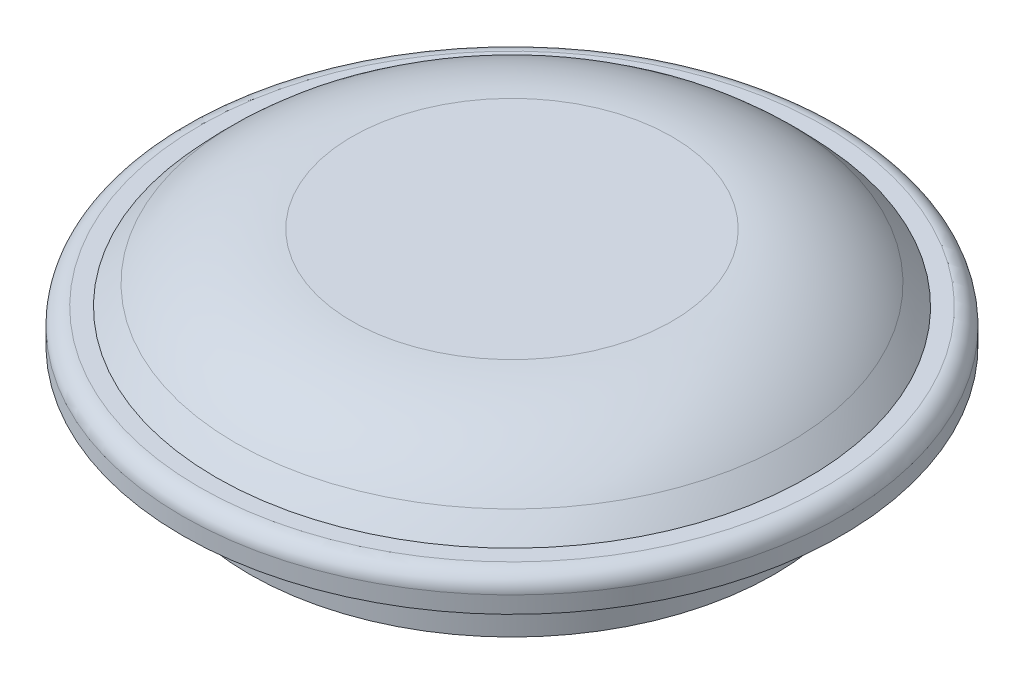
ISO-10303-21;
HEADER;
FILE_DESCRIPTION(('STEP AP214'),'2;1');
FILE_NAME('part.step','',(''),(''),'','','');
FILE_SCHEMA(('AUTOMOTIVE_DESIGN { 1 0 10303 214 1 1 1 1 }'));
ENDSEC;
DATA;
#1=APPLICATION_CONTEXT('core data for automotive mechanical design processes');
#2=APPLICATION_PROTOCOL_DEFINITION('international standard','automotive_design',2000,#1);
#3=PRODUCT_CONTEXT('',#1,'mechanical');
#4=PRODUCT('Part','Part','',(#3));
#5=PRODUCT_RELATED_PRODUCT_CATEGORY('part','',(#4));
#6=PRODUCT_DEFINITION_FORMATION('','',#4);
#7=PRODUCT_DEFINITION_CONTEXT('part definition',#1,'design');
#8=PRODUCT_DEFINITION('design','',#6,#7);
#9=PRODUCT_DEFINITION_SHAPE('','',#8);
#10=(LENGTH_UNIT() NAMED_UNIT(*) SI_UNIT(.MILLI.,.METRE.));
#11=(NAMED_UNIT(*) PLANE_ANGLE_UNIT() SI_UNIT($,.RADIAN.));
#12=(NAMED_UNIT(*) SI_UNIT($,.STERADIAN.) SOLID_ANGLE_UNIT());
#13=UNCERTAINTY_MEASURE_WITH_UNIT(LENGTH_MEASURE(1.E-05),#10,'distance_accuracy_value','');
#14=(GEOMETRIC_REPRESENTATION_CONTEXT(3) GLOBAL_UNCERTAINTY_ASSIGNED_CONTEXT((#13)) GLOBAL_UNIT_ASSIGNED_CONTEXT((#10,
#11,#12)) REPRESENTATION_CONTEXT('',''));
#15=CARTESIAN_POINT('',(0.,0.,0.));
#16=DIRECTION('',(0.,0.,1.));
#17=DIRECTION('',(1.,0.,0.));
#18=AXIS2_PLACEMENT_3D('',#15,#16,#17);
#19=CARTESIAN_POINT('',(0.,2.54,0.));
#20=DIRECTION('',(0.,-1.,0.));
#21=DIRECTION('',(0.,0.,-1.));
#22=AXIS2_PLACEMENT_3D('',#19,#20,#21);
#23=CYLINDRICAL_SURFACE('',#22,9.92666664866667);
#24=CARTESIAN_POINT('',(0.,2.54,0.));
#25=DIRECTION('',(0.,1.,0.));
#26=DIRECTION('',(0.,0.,1.));
#27=AXIS2_PLACEMENT_3D('',#24,#25,#26);
#28=CIRCLE('',#27,9.92666664866667);
#29=CARTESIAN_POINT('',(0.,2.54,9.92666664866667));
#30=VERTEX_POINT('',#29);
#31=EDGE_CURVE('E56',#30,#30,#28,.T.);
#32=ORIENTED_EDGE('',*,*,#31,.F.);
#33=EDGE_LOOP('',(#32));
#34=FACE_BOUND('',#33,.T.);
#35=CARTESIAN_POINT('',(0.,0.,0.));
#36=DIRECTION('',(0.,1.,0.));
#37=DIRECTION('',(0.,0.,1.));
#38=AXIS2_PLACEMENT_3D('',#35,#36,#37);
#39=CIRCLE('',#38,9.92666664866667);
#40=CARTESIAN_POINT('',(0.,0.,9.92666664866667));
#41=VERTEX_POINT('',#40);
#42=EDGE_CURVE('E57',#41,#41,#39,.T.);
#43=ORIENTED_EDGE('',*,*,#42,.T.);
#44=EDGE_LOOP('',(#43));
#45=FACE_BOUND('',#44,.T.);
#46=ADVANCED_FACE('F33',(#34,#45),#23,.T.);
#47=CARTESIAN_POINT('',(0.,0.,0.));
#48=DIRECTION('',(0.,1.,0.));
#49=DIRECTION('',(0.,0.,1.));
#50=AXIS2_PLACEMENT_3D('',#47,#48,#49);
#51=PLANE('',#50);
#52=ORIENTED_EDGE('',*,*,#42,.F.);
#53=EDGE_LOOP('',(#52));
#54=FACE_BOUND('',#53,.T.);
#55=ADVANCED_FACE('F84',(#54),#51,.F.);
#56=CARTESIAN_POINT('',(0.,3.81,0.));
#57=DIRECTION('',(0.,-1.,0.));
#58=DIRECTION('',(0.,0.,-1.));
#59=AXIS2_PLACEMENT_3D('',#56,#57,#58);
#60=CYLINDRICAL_SURFACE('',#59,12.4666666486667);
#61=CARTESIAN_POINT('',(0.,3.175,0.));
#62=DIRECTION('',(0.,1.,0.));
#63=DIRECTION('',(0.,0.,1.));
#64=AXIS2_PLACEMENT_3D('',#61,#62,#63);
#65=CIRCLE('',#64,12.4666666486667);
#66=CARTESIAN_POINT('',(0.,3.175,12.4666666486667));
#67=VERTEX_POINT('',#66);
#68=EDGE_CURVE('E44',#67,#67,#65,.F.);
#69=ORIENTED_EDGE('',*,*,#68,.T.);
#70=EDGE_LOOP('',(#69));
#71=FACE_BOUND('',#70,.T.);
#72=CARTESIAN_POINT('',(0.,2.54,0.));
#73=DIRECTION('',(0.,1.,0.));
#74=DIRECTION('',(0.,0.,1.));
#75=AXIS2_PLACEMENT_3D('',#72,#73,#74);
#76=CIRCLE('',#75,12.4666666486667);
#77=CARTESIAN_POINT('',(0.,2.54,12.4666666486667));
#78=VERTEX_POINT('',#77);
#79=EDGE_CURVE('E60',#78,#78,#76,.T.);
#80=ORIENTED_EDGE('',*,*,#79,.T.);
#81=EDGE_LOOP('',(#80));
#82=FACE_BOUND('',#81,.T.);
#83=ADVANCED_FACE('F66',(#71,#82),#60,.T.);
#84=CARTESIAN_POINT('',(0.,3.81,0.));
#85=DIRECTION('',(0.,1.,0.));
#86=DIRECTION('',(0.,0.,1.));
#87=AXIS2_PLACEMENT_3D('',#84,#85,#86);
#88=PLANE('',#87);
#89=CARTESIAN_POINT('',(0.,3.81,0.));
#90=DIRECTION('',(0.,1.,0.));
#91=DIRECTION('',(0.,0.,1.));
#92=AXIS2_PLACEMENT_3D('',#89,#90,#91);
#93=CIRCLE('',#92,11.8316666486667);
#94=CARTESIAN_POINT('',(0.,3.81,11.8316666486667));
#95=VERTEX_POINT('',#94);
#96=EDGE_CURVE('E48',#95,#95,#93,.T.);
#97=ORIENTED_EDGE('',*,*,#96,.T.);
#98=EDGE_LOOP('',(#97));
#99=FACE_BOUND('',#98,.T.);
#100=CARTESIAN_POINT('',(0.,3.81,0.));
#101=DIRECTION('',(0.,1.,0.));
#102=DIRECTION('',(0.,0.,1.));
#103=AXIS2_PLACEMENT_3D('',#100,#101,#102);
#104=CIRCLE('',#103,11.1966666486667);
#105=CARTESIAN_POINT('',(0.,3.81,11.1966666486667));
#106=VERTEX_POINT('',#105);
#107=EDGE_CURVE('E53',#106,#106,#104,.T.);
#108=ORIENTED_EDGE('',*,*,#107,.F.);
#109=EDGE_LOOP('',(#108));
#110=FACE_BOUND('',#109,.T.);
#111=ADVANCED_FACE('F71',(#99,#110),#88,.T.);
#112=CARTESIAN_POINT('',(0.,2.54,0.));
#113=DIRECTION('',(0.,1.,0.));
#114=DIRECTION('',(0.,0.,1.));
#115=AXIS2_PLACEMENT_3D('',#112,#113,#114);
#116=PLANE('',#115);
#117=ORIENTED_EDGE('',*,*,#31,.T.);
#118=EDGE_LOOP('',(#117));
#119=FACE_BOUND('',#118,.T.);
#120=ORIENTED_EDGE('',*,*,#79,.F.);
#121=EDGE_LOOP('',(#120));
#122=FACE_BOUND('',#121,.T.);
#123=ADVANCED_FACE('F68',(#119,#122),#116,.F.);
#124=CARTESIAN_POINT('',(0.,-6.38211152428228,0.));
#125=DIRECTION('',(0.,1.,0.));
#126=DIRECTION('',(0.,0.,1.));
#127=AXIS2_PLACEMENT_3D('',#124,#125,#126);
#128=DEGENERATE_TOROIDAL_SURFACE('',#127,0.0990392730163643,15.2142074914388,.F.);
#129=CARTESIAN_POINT('',(0.,4.57191556248356,0.));
#130=DIRECTION('',(0.,-1.,0.));
#131=DIRECTION('',(0.,0.,-1.));
#132=AXIS2_PLACEMENT_3D('',#129,#130,#131);
#133=CIRCLE('',#132,10.4594360039805);
#134=CARTESIAN_POINT('',(0.,4.57191556248356,-10.4594360039805));
#135=VERTEX_POINT('',#134);
#136=EDGE_CURVE('E10',#135,#135,#133,.T.);
#137=ORIENTED_EDGE('',*,*,#136,.T.);
#138=EDGE_LOOP('',(#137));
#139=FACE_BOUND('',#138,.T.);
#140=ORIENTED_EDGE('',*,*,#107,.T.);
#141=EDGE_LOOP('',(#140));
#142=FACE_BOUND('',#141,.T.);
#143=ADVANCED_FACE('F70',(#139,#142),#128,.F.);
#144=CARTESIAN_POINT('',(0.,3.175,0.));
#145=DIRECTION('',(0.,1.,0.));
#146=DIRECTION('',(0.,0.,1.));
#147=AXIS2_PLACEMENT_3D('',#144,#145,#146);
#148=TOROIDAL_SURFACE('',#147,11.8316666486667,0.635);
#149=ORIENTED_EDGE('',*,*,#68,.F.);
#150=EDGE_LOOP('',(#149));
#151=FACE_BOUND('',#150,.T.);
#152=ORIENTED_EDGE('',*,*,#96,.F.);
#153=EDGE_LOOP('',(#152));
#154=FACE_BOUND('',#153,.T.);
#155=ADVANCED_FACE('F78',(#151,#154),#148,.T.);
#156=CARTESIAN_POINT('',(-14.9345993456866,6.35,-12.4666666486667));
#157=DIRECTION('',(0.,-1.,0.));
#158=DIRECTION('',(0.,0.,-1.));
#159=AXIS2_PLACEMENT_3D('',#156,#157,#158);
#160=PLANE('',#159);
#161=CARTESIAN_POINT('',(0.,6.35,0.));
#162=DIRECTION('',(0.,-1.,0.));
#163=DIRECTION('',(0.,0.,-1.));
#164=AXIS2_PLACEMENT_3D('',#161,#162,#163);
#165=CIRCLE('',#164,6.05261310198852);
#166=CARTESIAN_POINT('',(0.,6.35,-6.05261310198852));
#167=VERTEX_POINT('',#166);
#168=EDGE_CURVE('E40',#167,#167,#165,.F.);
#169=ORIENTED_EDGE('',*,*,#168,.T.);
#170=EDGE_LOOP('',(#169));
#171=FACE_BOUND('',#170,.T.);
#172=ADVANCED_FACE('F95',(#171),#160,.F.);
#173=CARTESIAN_POINT('',(0.,0.,0.));
#174=DIRECTION('',(0.,-1.,0.));
#175=DIRECTION('',(0.,0.,-1.));
#176=AXIS2_PLACEMENT_3D('',#173,#174,#175);
#177=DEGENERATE_TOROIDAL_SURFACE('',#176,6.05261310198852,6.35,.T.);
#178=ORIENTED_EDGE('',*,*,#136,.F.);
#179=EDGE_LOOP('',(#178));
#180=FACE_BOUND('',#179,.T.);
#181=ORIENTED_EDGE('',*,*,#168,.F.);
#182=EDGE_LOOP('',(#181));
#183=FACE_BOUND('',#182,.T.);
#184=ADVANCED_FACE('F35',(#180,#183),#177,.T.);
#185=CLOSED_SHELL('',(#46,#55,#83,#111,#123,#143,#155,#172,#184));
#186=MANIFOLD_SOLID_BREP('B2',#185);
#187=ADVANCED_BREP_SHAPE_REPRESENTATION('',(#18,#186),#14);
#188=SHAPE_DEFINITION_REPRESENTATION(#9,#187);
ENDSEC;
END-ISO-10303-21;
